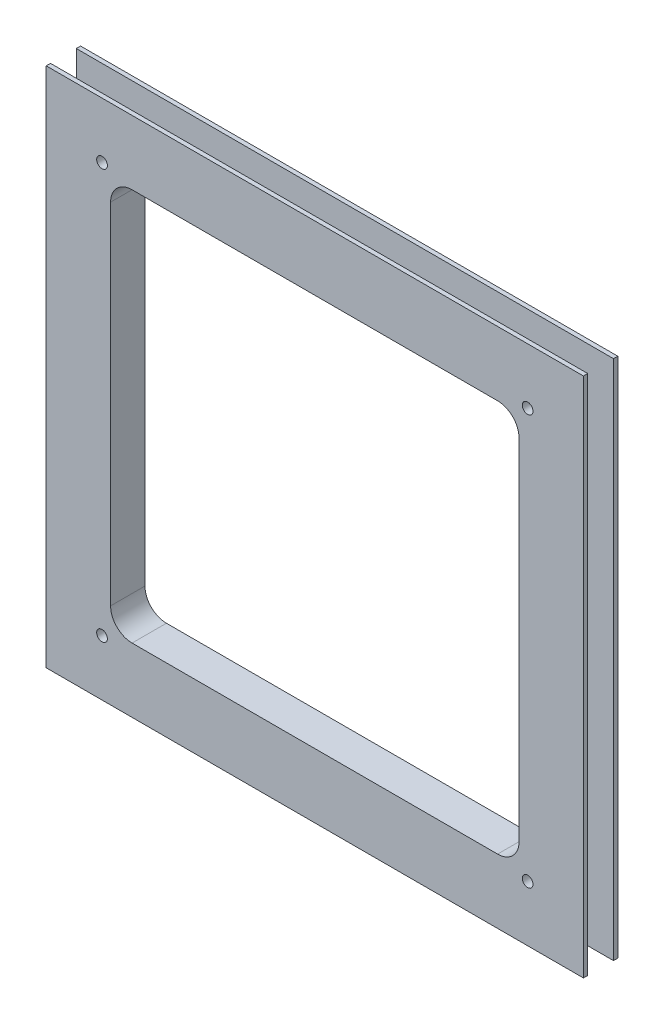
ISO-10303-21;
HEADER;
FILE_DESCRIPTION(('STEP AP214'),'2;1');
FILE_NAME('part.step','',(''),(''),'','','');
FILE_SCHEMA(('AUTOMOTIVE_DESIGN { 1 0 10303 214 1 1 1 1 }'));
ENDSEC;
DATA;
#1=APPLICATION_CONTEXT('core data for automotive mechanical design processes');
#2=APPLICATION_PROTOCOL_DEFINITION('international standard','automotive_design',2000,#1);
#3=PRODUCT_CONTEXT('',#1,'mechanical');
#4=PRODUCT('Part','Part','',(#3));
#5=PRODUCT_RELATED_PRODUCT_CATEGORY('part','',(#4));
#6=PRODUCT_DEFINITION_FORMATION('','',#4);
#7=PRODUCT_DEFINITION_CONTEXT('part definition',#1,'design');
#8=PRODUCT_DEFINITION('design','',#6,#7);
#9=PRODUCT_DEFINITION_SHAPE('','',#8);
#10=(LENGTH_UNIT() NAMED_UNIT(*) SI_UNIT(.MILLI.,.METRE.));
#11=(NAMED_UNIT(*) PLANE_ANGLE_UNIT() SI_UNIT($,.RADIAN.));
#12=(NAMED_UNIT(*) SI_UNIT($,.STERADIAN.) SOLID_ANGLE_UNIT());
#13=UNCERTAINTY_MEASURE_WITH_UNIT(LENGTH_MEASURE(1.E-05),#10,'distance_accuracy_value','');
#14=(GEOMETRIC_REPRESENTATION_CONTEXT(3) GLOBAL_UNCERTAINTY_ASSIGNED_CONTEXT((#13)) GLOBAL_UNIT_ASSIGNED_CONTEXT((#10,
#11,#12)) REPRESENTATION_CONTEXT('',''));
#15=CARTESIAN_POINT('',(0.,0.,0.));
#16=DIRECTION('',(0.,0.,1.));
#17=DIRECTION('',(1.,0.,0.));
#18=AXIS2_PLACEMENT_3D('',#15,#16,#17);
#19=CARTESIAN_POINT('',(0.,0.,6.));
#20=DIRECTION('',(0.,0.,1.));
#21=DIRECTION('',(1.,0.,0.));
#22=AXIS2_PLACEMENT_3D('',#19,#20,#21);
#23=PLANE('',#22);
#24=DIRECTION('',(0.,1.,0.));
#25=VECTOR('',#24,1.);
#26=CARTESIAN_POINT('',(-125.15,-121.45,6.));
#27=LINE('',#26,#25);
#28=CARTESIAN_POINT('',(-125.15,-121.45,6.));
#29=VERTEX_POINT('',#28);
#30=CARTESIAN_POINT('',(-125.15,121.45,6.));
#31=VERTEX_POINT('',#30);
#32=EDGE_CURVE('E267',#29,#31,#27,.T.);
#33=ORIENTED_EDGE('',*,*,#32,.T.);
#34=DIRECTION('',(1.,0.,0.));
#35=VECTOR('',#34,1.);
#36=CARTESIAN_POINT('',(-125.15,121.45,6.));
#37=LINE('',#36,#35);
#38=CARTESIAN_POINT('',(125.15,121.45,6.));
#39=VERTEX_POINT('',#38);
#40=EDGE_CURVE('E273',#31,#39,#37,.T.);
#41=ORIENTED_EDGE('',*,*,#40,.T.);
#42=DIRECTION('',(0.,1.,0.));
#43=VECTOR('',#42,1.);
#44=CARTESIAN_POINT('',(125.15,-121.45,6.));
#45=LINE('',#44,#43);
#46=CARTESIAN_POINT('',(125.15,-121.45,6.));
#47=VERTEX_POINT('',#46);
#48=EDGE_CURVE('E279',#39,#47,#45,.F.);
#49=ORIENTED_EDGE('',*,*,#48,.T.);
#50=DIRECTION('',(1.,0.,0.));
#51=VECTOR('',#50,1.);
#52=CARTESIAN_POINT('',(-125.15,-121.45,6.));
#53=LINE('',#52,#51);
#54=EDGE_CURVE('E261',#47,#29,#53,.F.);
#55=ORIENTED_EDGE('',*,*,#54,.T.);
#56=EDGE_LOOP('',(#33,#41,#49,#55));
#57=FACE_BOUND('',#56,.T.);
#58=CARTESIAN_POINT('',(-102.15,98.45,6.));
#59=DIRECTION('',(0.,0.,1.));
#60=DIRECTION('',(1.,0.,0.));
#61=AXIS2_PLACEMENT_3D('',#58,#59,#60);
#62=CIRCLE('',#61,9.99999999999999);
#63=CARTESIAN_POINT('',(-112.15,98.45,6.));
#64=VERTEX_POINT('',#63);
#65=CARTESIAN_POINT('',(-102.15,108.45,6.));
#66=VERTEX_POINT('',#65);
#67=EDGE_CURVE('E243',#64,#66,#62,.F.);
#68=ORIENTED_EDGE('',*,*,#67,.F.);
#69=DIRECTION('',(0.,1.,0.));
#70=VECTOR('',#69,1.);
#71=CARTESIAN_POINT('',(-112.15,-108.45,6.));
#72=LINE('',#71,#70);
#73=CARTESIAN_POINT('',(-112.15,-98.45,6.));
#74=VERTEX_POINT('',#73);
#75=EDGE_CURVE('E166',#74,#64,#72,.T.);
#76=ORIENTED_EDGE('',*,*,#75,.F.);
#77=CARTESIAN_POINT('',(-102.15,-98.45,6.));
#78=DIRECTION('',(0.,0.,1.));
#79=DIRECTION('',(1.,0.,0.));
#80=AXIS2_PLACEMENT_3D('',#77,#78,#79);
#81=CIRCLE('',#80,9.99999999999999);
#82=CARTESIAN_POINT('',(-102.15,-108.45,6.));
#83=VERTEX_POINT('',#82);
#84=EDGE_CURVE('E247',#83,#74,#81,.F.);
#85=ORIENTED_EDGE('',*,*,#84,.F.);
#86=DIRECTION('',(1.,0.,0.));
#87=VECTOR('',#86,1.);
#88=CARTESIAN_POINT('',(112.15,-108.45,6.));
#89=LINE('',#88,#87);
#90=CARTESIAN_POINT('',(102.15,-108.45,6.));
#91=VERTEX_POINT('',#90);
#92=EDGE_CURVE('E170',#91,#83,#89,.F.);
#93=ORIENTED_EDGE('',*,*,#92,.F.);
#94=CARTESIAN_POINT('',(102.15,-98.45,6.));
#95=DIRECTION('',(0.,0.,1.));
#96=DIRECTION('',(1.,0.,0.));
#97=AXIS2_PLACEMENT_3D('',#94,#95,#96);
#98=CIRCLE('',#97,9.99999999999999);
#99=CARTESIAN_POINT('',(112.15,-98.45,6.));
#100=VERTEX_POINT('',#99);
#101=EDGE_CURVE('E144',#100,#91,#98,.F.);
#102=ORIENTED_EDGE('',*,*,#101,.F.);
#103=DIRECTION('',(0.,1.,0.));
#104=VECTOR('',#103,1.);
#105=CARTESIAN_POINT('',(112.15,-108.45,6.));
#106=LINE('',#105,#104);
#107=CARTESIAN_POINT('',(112.15,98.45,6.));
#108=VERTEX_POINT('',#107);
#109=EDGE_CURVE('E139',#108,#100,#106,.F.);
#110=ORIENTED_EDGE('',*,*,#109,.F.);
#111=CARTESIAN_POINT('',(102.15,98.45,6.));
#112=DIRECTION('',(0.,0.,1.));
#113=DIRECTION('',(1.,0.,0.));
#114=AXIS2_PLACEMENT_3D('',#111,#112,#113);
#115=CIRCLE('',#114,9.99999999999999);
#116=CARTESIAN_POINT('',(102.15,108.45,6.));
#117=VERTEX_POINT('',#116);
#118=EDGE_CURVE('E19',#117,#108,#115,.F.);
#119=ORIENTED_EDGE('',*,*,#118,.F.);
#120=DIRECTION('',(1.,0.,0.));
#121=VECTOR('',#120,1.);
#122=CARTESIAN_POINT('',(112.15,108.45,6.));
#123=LINE('',#122,#121);
#124=EDGE_CURVE('E134',#66,#117,#123,.T.);
#125=ORIENTED_EDGE('',*,*,#124,.F.);
#126=EDGE_LOOP('',(#68,#76,#85,#93,#102,#110,#119,#125));
#127=FACE_BOUND('',#126,.T.);
#128=ADVANCED_FACE('F16',(#57,#127),#23,.F.);
#129=CARTESIAN_POINT('',(112.15,108.45,-6.));
#130=DIRECTION('',(0.,1.,0.));
#131=DIRECTION('',(0.,0.,1.));
#132=AXIS2_PLACEMENT_3D('',#129,#130,#131);
#133=PLANE('',#132);
#134=DIRECTION('',(1.,0.,0.));
#135=VECTOR('',#134,1.);
#136=CARTESIAN_POINT('',(0.,108.45,-6.));
#137=LINE('',#136,#135);
#138=CARTESIAN_POINT('',(-102.15,108.45,-6.));
#139=VERTEX_POINT('',#138);
#140=CARTESIAN_POINT('',(102.15,108.45,-6.));
#141=VERTEX_POINT('',#140);
#142=EDGE_CURVE('E242',#139,#141,#137,.T.);
#143=ORIENTED_EDGE('',*,*,#142,.F.);
#144=DIRECTION('',(0.,0.,1.));
#145=VECTOR('',#144,1.);
#146=CARTESIAN_POINT('',(-102.15,108.45,-6.));
#147=LINE('',#146,#145);
#148=EDGE_CURVE('E246',#66,#139,#147,.F.);
#149=ORIENTED_EDGE('',*,*,#148,.F.);
#150=ORIENTED_EDGE('',*,*,#124,.T.);
#151=DIRECTION('',(0.,0.,1.));
#152=VECTOR('',#151,1.);
#153=CARTESIAN_POINT('',(102.15,108.45,-6.));
#154=LINE('',#153,#152);
#155=EDGE_CURVE('E154',#141,#117,#154,.T.);
#156=ORIENTED_EDGE('',*,*,#155,.F.);
#157=EDGE_LOOP('',(#143,#149,#150,#156));
#158=FACE_BOUND('',#157,.T.);
#159=ADVANCED_FACE('F497',(#158),#133,.T.);
#160=CARTESIAN_POINT('',(102.15,98.45,-6.));
#161=DIRECTION('',(0.,0.,1.));
#162=DIRECTION('',(1.,0.,0.));
#163=AXIS2_PLACEMENT_3D('',#160,#161,#162);
#164=CYLINDRICAL_SURFACE('',#163,9.99999999999999);
#165=ORIENTED_EDGE('',*,*,#118,.T.);
#166=DIRECTION('',(0.,0.,-1.));
#167=VECTOR('',#166,1.);
#168=CARTESIAN_POINT('',(112.15,98.45,-6.));
#169=LINE('',#168,#167);
#170=CARTESIAN_POINT('',(112.15,98.45,-6.));
#171=VERTEX_POINT('',#170);
#172=EDGE_CURVE('E148',#171,#108,#169,.F.);
#173=ORIENTED_EDGE('',*,*,#172,.F.);
#174=CARTESIAN_POINT('',(102.15,98.45,-6.));
#175=DIRECTION('',(0.,0.,1.));
#176=DIRECTION('',(1.,0.,0.));
#177=AXIS2_PLACEMENT_3D('',#174,#175,#176);
#178=CIRCLE('',#177,9.99999999999999);
#179=EDGE_CURVE('E240',#141,#171,#178,.F.);
#180=ORIENTED_EDGE('',*,*,#179,.F.);
#181=ORIENTED_EDGE('',*,*,#155,.T.);
#182=EDGE_LOOP('',(#165,#173,#180,#181));
#183=FACE_BOUND('',#182,.T.);
#184=ADVANCED_FACE('F151',(#183),#164,.T.);
#185=CARTESIAN_POINT('',(112.15,-108.45,-6.));
#186=DIRECTION('',(1.,0.,0.));
#187=DIRECTION('',(0.,0.,-1.));
#188=AXIS2_PLACEMENT_3D('',#185,#186,#187);
#189=PLANE('',#188);
#190=DIRECTION('',(0.,1.,0.));
#191=VECTOR('',#190,1.);
#192=CARTESIAN_POINT('',(112.15,0.,-6.));
#193=LINE('',#192,#191);
#194=CARTESIAN_POINT('',(112.15,-98.45,-6.));
#195=VERTEX_POINT('',#194);
#196=EDGE_CURVE('E157',#171,#195,#193,.F.);
#197=ORIENTED_EDGE('',*,*,#196,.F.);
#198=ORIENTED_EDGE('',*,*,#172,.T.);
#199=ORIENTED_EDGE('',*,*,#109,.T.);
#200=DIRECTION('',(0.,0.,1.));
#201=VECTOR('',#200,1.);
#202=CARTESIAN_POINT('',(112.15,-98.45,-6.));
#203=LINE('',#202,#201);
#204=EDGE_CURVE('E159',#195,#100,#203,.T.);
#205=ORIENTED_EDGE('',*,*,#204,.F.);
#206=EDGE_LOOP('',(#197,#198,#199,#205));
#207=FACE_BOUND('',#206,.T.);
#208=ADVANCED_FACE('F155',(#207),#189,.T.);
#209=CARTESIAN_POINT('',(102.15,-98.45,-6.));
#210=DIRECTION('',(0.,0.,1.));
#211=DIRECTION('',(1.,0.,0.));
#212=AXIS2_PLACEMENT_3D('',#209,#210,#211);
#213=CYLINDRICAL_SURFACE('',#212,9.99999999999999);
#214=ORIENTED_EDGE('',*,*,#101,.T.);
#215=DIRECTION('',(0.,0.,-1.));
#216=VECTOR('',#215,1.);
#217=CARTESIAN_POINT('',(102.15,-108.45,-6.));
#218=LINE('',#217,#216);
#219=CARTESIAN_POINT('',(102.15,-108.45,-6.));
#220=VERTEX_POINT('',#219);
#221=EDGE_CURVE('E172',#220,#91,#218,.F.);
#222=ORIENTED_EDGE('',*,*,#221,.F.);
#223=CARTESIAN_POINT('',(102.15,-98.45,-6.));
#224=DIRECTION('',(0.,0.,1.));
#225=DIRECTION('',(1.,0.,0.));
#226=AXIS2_PLACEMENT_3D('',#223,#224,#225);
#227=CIRCLE('',#226,9.99999999999999);
#228=EDGE_CURVE('E237',#195,#220,#227,.F.);
#229=ORIENTED_EDGE('',*,*,#228,.F.);
#230=ORIENTED_EDGE('',*,*,#204,.T.);
#231=EDGE_LOOP('',(#214,#222,#229,#230));
#232=FACE_BOUND('',#231,.T.);
#233=ADVANCED_FACE('F491',(#232),#213,.T.);
#234=CARTESIAN_POINT('',(112.15,-108.45,-6.));
#235=DIRECTION('',(0.,-1.,0.));
#236=DIRECTION('',(0.,0.,-1.));
#237=AXIS2_PLACEMENT_3D('',#234,#235,#236);
#238=PLANE('',#237);
#239=ORIENTED_EDGE('',*,*,#92,.T.);
#240=DIRECTION('',(0.,0.,1.));
#241=VECTOR('',#240,1.);
#242=CARTESIAN_POINT('',(-102.15,-108.45,-6.));
#243=LINE('',#242,#241);
#244=CARTESIAN_POINT('',(-102.15,-108.45,-6.));
#245=VERTEX_POINT('',#244);
#246=EDGE_CURVE('E171',#245,#83,#243,.T.);
#247=ORIENTED_EDGE('',*,*,#246,.F.);
#248=DIRECTION('',(1.,0.,0.));
#249=VECTOR('',#248,1.);
#250=CARTESIAN_POINT('',(0.,-108.45,-6.));
#251=LINE('',#250,#249);
#252=EDGE_CURVE('E236',#220,#245,#251,.F.);
#253=ORIENTED_EDGE('',*,*,#252,.F.);
#254=ORIENTED_EDGE('',*,*,#221,.T.);
#255=EDGE_LOOP('',(#239,#247,#253,#254));
#256=FACE_BOUND('',#255,.T.);
#257=ADVANCED_FACE('F487',(#256),#238,.T.);
#258=CARTESIAN_POINT('',(-102.15,-98.45,-6.));
#259=DIRECTION('',(0.,0.,1.));
#260=DIRECTION('',(1.,0.,0.));
#261=AXIS2_PLACEMENT_3D('',#258,#259,#260);
#262=CYLINDRICAL_SURFACE('',#261,9.99999999999999);
#263=ORIENTED_EDGE('',*,*,#84,.T.);
#264=DIRECTION('',(0.,0.,1.));
#265=VECTOR('',#264,1.);
#266=CARTESIAN_POINT('',(-112.15,-98.45,-6.));
#267=LINE('',#266,#265);
#268=CARTESIAN_POINT('',(-112.15,-98.45,-6.));
#269=VERTEX_POINT('',#268);
#270=EDGE_CURVE('E169',#269,#74,#267,.T.);
#271=ORIENTED_EDGE('',*,*,#270,.F.);
#272=CARTESIAN_POINT('',(-102.15,-98.45,-6.));
#273=DIRECTION('',(0.,0.,1.));
#274=DIRECTION('',(1.,0.,0.));
#275=AXIS2_PLACEMENT_3D('',#272,#273,#274);
#276=CIRCLE('',#275,9.99999999999999);
#277=EDGE_CURVE('E233',#245,#269,#276,.F.);
#278=ORIENTED_EDGE('',*,*,#277,.F.);
#279=ORIENTED_EDGE('',*,*,#246,.T.);
#280=EDGE_LOOP('',(#263,#271,#278,#279));
#281=FACE_BOUND('',#280,.T.);
#282=ADVANCED_FACE('F483',(#281),#262,.T.);
#283=CARTESIAN_POINT('',(-112.15,-108.45,-6.));
#284=DIRECTION('',(-1.,0.,0.));
#285=DIRECTION('',(0.,0.,1.));
#286=AXIS2_PLACEMENT_3D('',#283,#284,#285);
#287=PLANE('',#286);
#288=ORIENTED_EDGE('',*,*,#75,.T.);
#289=DIRECTION('',(0.,0.,1.));
#290=VECTOR('',#289,1.);
#291=CARTESIAN_POINT('',(-112.15,98.45,-6.));
#292=LINE('',#291,#290);
#293=CARTESIAN_POINT('',(-112.15,98.45,-6.));
#294=VERTEX_POINT('',#293);
#295=EDGE_CURVE('E168',#294,#64,#292,.T.);
#296=ORIENTED_EDGE('',*,*,#295,.F.);
#297=DIRECTION('',(0.,1.,0.));
#298=VECTOR('',#297,1.);
#299=CARTESIAN_POINT('',(-112.15,0.,-6.));
#300=LINE('',#299,#298);
#301=EDGE_CURVE('E232',#269,#294,#300,.T.);
#302=ORIENTED_EDGE('',*,*,#301,.F.);
#303=ORIENTED_EDGE('',*,*,#270,.T.);
#304=EDGE_LOOP('',(#288,#296,#302,#303));
#305=FACE_BOUND('',#304,.T.);
#306=ADVANCED_FACE('F479',(#305),#287,.T.);
#307=CARTESIAN_POINT('',(-102.15,98.45,-6.));
#308=DIRECTION('',(0.,0.,1.));
#309=DIRECTION('',(1.,0.,0.));
#310=AXIS2_PLACEMENT_3D('',#307,#308,#309);
#311=CYLINDRICAL_SURFACE('',#310,9.99999999999999);
#312=ORIENTED_EDGE('',*,*,#67,.T.);
#313=ORIENTED_EDGE('',*,*,#148,.T.);
#314=CARTESIAN_POINT('',(-102.15,98.45,-6.));
#315=DIRECTION('',(0.,0.,1.));
#316=DIRECTION('',(1.,0.,0.));
#317=AXIS2_PLACEMENT_3D('',#314,#315,#316);
#318=CIRCLE('',#317,9.99999999999999);
#319=EDGE_CURVE('E228',#294,#139,#318,.F.);
#320=ORIENTED_EDGE('',*,*,#319,.F.);
#321=ORIENTED_EDGE('',*,*,#295,.T.);
#322=EDGE_LOOP('',(#312,#313,#320,#321));
#323=FACE_BOUND('',#322,.T.);
#324=ADVANCED_FACE('F475',(#323),#311,.T.);
#325=CARTESIAN_POINT('',(-125.15,-121.45,8.));
#326=DIRECTION('',(0.,1.,0.));
#327=DIRECTION('',(0.,0.,1.));
#328=AXIS2_PLACEMENT_3D('',#325,#326,#327);
#329=PLANE('',#328);
#330=ORIENTED_EDGE('',*,*,#54,.F.);
#331=DIRECTION('',(0.,0.,1.));
#332=VECTOR('',#331,1.);
#333=CARTESIAN_POINT('',(125.15,-121.45,8.));
#334=LINE('',#333,#332);
#335=CARTESIAN_POINT('',(125.15,-121.45,8.));
#336=VERTEX_POINT('',#335);
#337=EDGE_CURVE('E282',#47,#336,#334,.T.);
#338=ORIENTED_EDGE('',*,*,#337,.T.);
#339=DIRECTION('',(-1.,0.,0.));
#340=VECTOR('',#339,1.);
#341=CARTESIAN_POINT('',(0.,-121.45,8.));
#342=LINE('',#341,#340);
#343=CARTESIAN_POINT('',(-125.15,-121.45,8.));
#344=VERTEX_POINT('',#343);
#345=EDGE_CURVE('E231',#336,#344,#342,.T.);
#346=ORIENTED_EDGE('',*,*,#345,.T.);
#347=DIRECTION('',(0.,0.,-1.));
#348=VECTOR('',#347,1.);
#349=CARTESIAN_POINT('',(-125.15,-121.45,8.));
#350=LINE('',#349,#348);
#351=EDGE_CURVE('E264',#344,#29,#350,.T.);
#352=ORIENTED_EDGE('',*,*,#351,.T.);
#353=EDGE_LOOP('',(#330,#338,#346,#352));
#354=FACE_BOUND('',#353,.T.);
#355=ADVANCED_FACE('F471',(#354),#329,.F.);
#356=CARTESIAN_POINT('',(-125.15,-121.45,8.));
#357=DIRECTION('',(1.,0.,0.));
#358=DIRECTION('',(0.,0.,-1.));
#359=AXIS2_PLACEMENT_3D('',#356,#357,#358);
#360=PLANE('',#359);
#361=ORIENTED_EDGE('',*,*,#32,.F.);
#362=ORIENTED_EDGE('',*,*,#351,.F.);
#363=DIRECTION('',(0.,1.,0.));
#364=VECTOR('',#363,1.);
#365=CARTESIAN_POINT('',(-125.15,0.,8.));
#366=LINE('',#365,#364);
#367=CARTESIAN_POINT('',(-125.15,121.45,8.));
#368=VERTEX_POINT('',#367);
#369=EDGE_CURVE('E302',#344,#368,#366,.T.);
#370=ORIENTED_EDGE('',*,*,#369,.T.);
#371=DIRECTION('',(0.,0.,-1.));
#372=VECTOR('',#371,1.);
#373=CARTESIAN_POINT('',(-125.15,121.45,8.));
#374=LINE('',#373,#372);
#375=EDGE_CURVE('E270',#368,#31,#374,.T.);
#376=ORIENTED_EDGE('',*,*,#375,.T.);
#377=EDGE_LOOP('',(#361,#362,#370,#376));
#378=FACE_BOUND('',#377,.T.);
#379=ADVANCED_FACE('F467',(#378),#360,.F.);
#380=CARTESIAN_POINT('',(-125.15,121.45,8.));
#381=DIRECTION('',(0.,-1.,0.));
#382=DIRECTION('',(0.,0.,-1.));
#383=AXIS2_PLACEMENT_3D('',#380,#381,#382);
#384=PLANE('',#383);
#385=ORIENTED_EDGE('',*,*,#40,.F.);
#386=ORIENTED_EDGE('',*,*,#375,.F.);
#387=DIRECTION('',(-1.,0.,0.));
#388=VECTOR('',#387,1.);
#389=CARTESIAN_POINT('',(0.,121.45,8.));
#390=LINE('',#389,#388);
#391=CARTESIAN_POINT('',(125.15,121.45,8.));
#392=VERTEX_POINT('',#391);
#393=EDGE_CURVE('E305',#368,#392,#390,.F.);
#394=ORIENTED_EDGE('',*,*,#393,.T.);
#395=DIRECTION('',(0.,0.,1.));
#396=VECTOR('',#395,1.);
#397=CARTESIAN_POINT('',(125.15,121.45,8.));
#398=LINE('',#397,#396);
#399=EDGE_CURVE('E276',#392,#39,#398,.F.);
#400=ORIENTED_EDGE('',*,*,#399,.T.);
#401=EDGE_LOOP('',(#385,#386,#394,#400));
#402=FACE_BOUND('',#401,.T.);
#403=ADVANCED_FACE('F463',(#402),#384,.F.);
#404=CARTESIAN_POINT('',(125.15,-121.45,8.));
#405=DIRECTION('',(-1.,0.,0.));
#406=DIRECTION('',(0.,0.,1.));
#407=AXIS2_PLACEMENT_3D('',#404,#405,#406);
#408=PLANE('',#407);
#409=ORIENTED_EDGE('',*,*,#48,.F.);
#410=ORIENTED_EDGE('',*,*,#399,.F.);
#411=DIRECTION('',(0.,1.,0.));
#412=VECTOR('',#411,1.);
#413=CARTESIAN_POINT('',(125.15,0.,8.));
#414=LINE('',#413,#412);
#415=EDGE_CURVE('E227',#392,#336,#414,.F.);
#416=ORIENTED_EDGE('',*,*,#415,.T.);
#417=ORIENTED_EDGE('',*,*,#337,.F.);
#418=EDGE_LOOP('',(#409,#410,#416,#417));
#419=FACE_BOUND('',#418,.T.);
#420=ADVANCED_FACE('F459',(#419),#408,.F.);
#421=CARTESIAN_POINT('',(0.,0.,-6.));
#422=DIRECTION('',(0.,0.,1.));
#423=DIRECTION('',(1.,0.,0.));
#424=AXIS2_PLACEMENT_3D('',#421,#422,#423);
#425=PLANE('',#424);
#426=DIRECTION('',(0.,1.,0.));
#427=VECTOR('',#426,1.);
#428=CARTESIAN_POINT('',(-125.15,-121.45,-6.));
#429=LINE('',#428,#427);
#430=CARTESIAN_POINT('',(-125.15,121.45,-6.));
#431=VERTEX_POINT('',#430);
#432=CARTESIAN_POINT('',(-125.15,-121.45,-6.));
#433=VERTEX_POINT('',#432);
#434=EDGE_CURVE('E324',#431,#433,#429,.F.);
#435=ORIENTED_EDGE('',*,*,#434,.T.);
#436=DIRECTION('',(1.,0.,0.));
#437=VECTOR('',#436,1.);
#438=CARTESIAN_POINT('',(-125.15,-121.45,-6.));
#439=LINE('',#438,#437);
#440=CARTESIAN_POINT('',(125.15,-121.45,-6.));
#441=VERTEX_POINT('',#440);
#442=EDGE_CURVE('E318',#433,#441,#439,.T.);
#443=ORIENTED_EDGE('',*,*,#442,.T.);
#444=DIRECTION('',(0.,1.,0.));
#445=VECTOR('',#444,1.);
#446=CARTESIAN_POINT('',(125.15,-121.45,-6.));
#447=LINE('',#446,#445);
#448=CARTESIAN_POINT('',(125.15,121.45,-6.));
#449=VERTEX_POINT('',#448);
#450=EDGE_CURVE('E217',#441,#449,#447,.T.);
#451=ORIENTED_EDGE('',*,*,#450,.T.);
#452=DIRECTION('',(1.,0.,0.));
#453=VECTOR('',#452,1.);
#454=CARTESIAN_POINT('',(-125.15,121.45,-6.));
#455=LINE('',#454,#453);
#456=EDGE_CURVE('E299',#449,#431,#455,.F.);
#457=ORIENTED_EDGE('',*,*,#456,.T.);
#458=EDGE_LOOP('',(#435,#443,#451,#457));
#459=FACE_BOUND('',#458,.T.);
#460=ORIENTED_EDGE('',*,*,#301,.T.);
#461=ORIENTED_EDGE('',*,*,#319,.T.);
#462=ORIENTED_EDGE('',*,*,#142,.T.);
#463=ORIENTED_EDGE('',*,*,#179,.T.);
#464=ORIENTED_EDGE('',*,*,#196,.T.);
#465=ORIENTED_EDGE('',*,*,#228,.T.);
#466=ORIENTED_EDGE('',*,*,#252,.T.);
#467=ORIENTED_EDGE('',*,*,#277,.T.);
#468=EDGE_LOOP('',(#460,#461,#462,#463,#464,#465,#466,#467));
#469=FACE_BOUND('',#468,.T.);
#470=ADVANCED_FACE('F456',(#459,#469),#425,.T.);
#471=CARTESIAN_POINT('',(0.,0.,8.));
#472=DIRECTION('',(0.,0.,-1.));
#473=DIRECTION('',(-1.,0.,0.));
#474=AXIS2_PLACEMENT_3D('',#471,#472,#473);
#475=PLANE('',#474);
#476=CARTESIAN_POINT('',(85.15,-81.45,8.00000000000001));
#477=DIRECTION('',(0.,0.,-1.));
#478=DIRECTION('',(-1.,0.,0.));
#479=AXIS2_PLACEMENT_3D('',#476,#477,#478);
#480=CIRCLE('',#479,9.99999999999999);
#481=CARTESIAN_POINT('',(95.15,-81.45,8.00000000000001));
#482=VERTEX_POINT('',#481);
#483=CARTESIAN_POINT('',(85.15,-91.45,8.00000000000001));
#484=VERTEX_POINT('',#483);
#485=EDGE_CURVE('E206',#482,#484,#480,.T.);
#486=ORIENTED_EDGE('',*,*,#485,.T.);
#487=DIRECTION('',(1.,0.,0.));
#488=VECTOR('',#487,1.);
#489=CARTESIAN_POINT('',(-95.15,-91.45,8.00000000000001));
#490=LINE('',#489,#488);
#491=CARTESIAN_POINT('',(-85.15,-91.45,8.00000000000001));
#492=VERTEX_POINT('',#491);
#493=EDGE_CURVE('E209',#484,#492,#490,.F.);
#494=ORIENTED_EDGE('',*,*,#493,.T.);
#495=CARTESIAN_POINT('',(-85.15,-81.45,8.00000000000001));
#496=DIRECTION('',(0.,0.,-1.));
#497=DIRECTION('',(-1.,0.,0.));
#498=AXIS2_PLACEMENT_3D('',#495,#496,#497);
#499=CIRCLE('',#498,9.99999999999999);
#500=CARTESIAN_POINT('',(-95.15,-81.45,8.00000000000001));
#501=VERTEX_POINT('',#500);
#502=EDGE_CURVE('E210',#492,#501,#499,.T.);
#503=ORIENTED_EDGE('',*,*,#502,.T.);
#504=DIRECTION('',(0.,1.,0.));
#505=VECTOR('',#504,1.);
#506=CARTESIAN_POINT('',(-95.15,91.45,8.00000000000001));
#507=LINE('',#506,#505);
#508=CARTESIAN_POINT('',(-95.15,81.45,8.00000000000001));
#509=VERTEX_POINT('',#508);
#510=EDGE_CURVE('E213',#501,#509,#507,.T.);
#511=ORIENTED_EDGE('',*,*,#510,.T.);
#512=CARTESIAN_POINT('',(-85.15,81.45,8.00000000000001));
#513=DIRECTION('',(0.,0.,-1.));
#514=DIRECTION('',(-1.,0.,0.));
#515=AXIS2_PLACEMENT_3D('',#512,#513,#514);
#516=CIRCLE('',#515,9.99999999999999);
#517=CARTESIAN_POINT('',(-85.15,91.45,8.00000000000001));
#518=VERTEX_POINT('',#517);
#519=EDGE_CURVE('E199',#509,#518,#516,.T.);
#520=ORIENTED_EDGE('',*,*,#519,.T.);
#521=DIRECTION('',(1.,0.,0.));
#522=VECTOR('',#521,1.);
#523=CARTESIAN_POINT('',(95.15,91.45,8.00000000000001));
#524=LINE('',#523,#522);
#525=CARTESIAN_POINT('',(85.15,91.45,8.00000000000001));
#526=VERTEX_POINT('',#525);
#527=EDGE_CURVE('E310',#518,#526,#524,.T.);
#528=ORIENTED_EDGE('',*,*,#527,.T.);
#529=CARTESIAN_POINT('',(85.15,81.45,8.00000000000001));
#530=DIRECTION('',(0.,0.,-1.));
#531=DIRECTION('',(-1.,0.,0.));
#532=AXIS2_PLACEMENT_3D('',#529,#530,#531);
#533=CIRCLE('',#532,9.99999999999999);
#534=CARTESIAN_POINT('',(95.15,81.45,8.00000000000001));
#535=VERTEX_POINT('',#534);
#536=EDGE_CURVE('E202',#526,#535,#533,.T.);
#537=ORIENTED_EDGE('',*,*,#536,.T.);
#538=DIRECTION('',(0.,1.,0.));
#539=VECTOR('',#538,1.);
#540=CARTESIAN_POINT('',(95.15,-91.45,8.00000000000001));
#541=LINE('',#540,#539);
#542=EDGE_CURVE('E205',#535,#482,#541,.F.);
#543=ORIENTED_EDGE('',*,*,#542,.T.);
#544=EDGE_LOOP('',(#486,#494,#503,#511,#520,#528,#537,#543));
#545=FACE_BOUND('',#544,.T.);
#546=ORIENTED_EDGE('',*,*,#393,.F.);
#547=ORIENTED_EDGE('',*,*,#369,.F.);
#548=ORIENTED_EDGE('',*,*,#345,.F.);
#549=ORIENTED_EDGE('',*,*,#415,.F.);
#550=EDGE_LOOP('',(#546,#547,#548,#549));
#551=FACE_BOUND('',#550,.T.);
#552=CARTESIAN_POINT('',(-99.15,-95.45,8.));
#553=DIRECTION('',(0.,0.,1.));
#554=DIRECTION('',(1.,0.,0.));
#555=AXIS2_PLACEMENT_3D('',#552,#553,#554);
#556=CIRCLE('',#555,2.5);
#557=CARTESIAN_POINT('',(-96.65,-95.45,8.));
#558=VERTEX_POINT('',#557);
#559=EDGE_CURVE('E214',#558,#558,#556,.F.);
#560=ORIENTED_EDGE('',*,*,#559,.T.);
#561=EDGE_LOOP('',(#560));
#562=FACE_BOUND('',#561,.T.);
#563=CARTESIAN_POINT('',(99.15,-95.45,8.));
#564=DIRECTION('',(0.,0.,1.));
#565=DIRECTION('',(1.,0.,0.));
#566=AXIS2_PLACEMENT_3D('',#563,#564,#565);
#567=CIRCLE('',#566,2.5);
#568=CARTESIAN_POINT('',(101.65,-95.45,8.));
#569=VERTEX_POINT('',#568);
#570=EDGE_CURVE('E218',#569,#569,#567,.F.);
#571=ORIENTED_EDGE('',*,*,#570,.T.);
#572=EDGE_LOOP('',(#571));
#573=FACE_BOUND('',#572,.T.);
#574=CARTESIAN_POINT('',(99.15,95.45,8.));
#575=DIRECTION('',(0.,0.,1.));
#576=DIRECTION('',(1.,0.,0.));
#577=AXIS2_PLACEMENT_3D('',#574,#575,#576);
#578=CIRCLE('',#577,2.5);
#579=CARTESIAN_POINT('',(101.65,95.45,8.));
#580=VERTEX_POINT('',#579);
#581=EDGE_CURVE('E221',#580,#580,#578,.F.);
#582=ORIENTED_EDGE('',*,*,#581,.T.);
#583=EDGE_LOOP('',(#582));
#584=FACE_BOUND('',#583,.T.);
#585=CARTESIAN_POINT('',(-99.15,95.45,8.));
#586=DIRECTION('',(0.,0.,1.));
#587=DIRECTION('',(1.,0.,0.));
#588=AXIS2_PLACEMENT_3D('',#585,#586,#587);
#589=CIRCLE('',#588,2.5);
#590=CARTESIAN_POINT('',(-96.65,95.45,8.));
#591=VERTEX_POINT('',#590);
#592=EDGE_CURVE('E224',#591,#591,#589,.F.);
#593=ORIENTED_EDGE('',*,*,#592,.T.);
#594=EDGE_LOOP('',(#593));
#595=FACE_BOUND('',#594,.T.);
#596=ADVANCED_FACE('F374',(#545,#551,#562,#573,#584,#595),#475,.F.);
#597=CARTESIAN_POINT('',(-99.15,95.45,8.));
#598=DIRECTION('',(0.,0.,1.));
#599=DIRECTION('',(1.,0.,0.));
#600=AXIS2_PLACEMENT_3D('',#597,#598,#599);
#601=CYLINDRICAL_SURFACE('',#600,2.5);
#602=ORIENTED_EDGE('',*,*,#592,.F.);
#603=EDGE_LOOP('',(#602));
#604=FACE_BOUND('',#603,.T.);
#605=CARTESIAN_POINT('',(-99.15,95.45,-8.00000000000001));
#606=DIRECTION('',(0.,0.,1.));
#607=DIRECTION('',(1.,0.,0.));
#608=AXIS2_PLACEMENT_3D('',#605,#606,#607);
#609=CIRCLE('',#608,2.5);
#610=CARTESIAN_POINT('',(-96.65,95.45,-8.00000000000001));
#611=VERTEX_POINT('',#610);
#612=EDGE_CURVE('E196',#611,#611,#609,.T.);
#613=ORIENTED_EDGE('',*,*,#612,.F.);
#614=EDGE_LOOP('',(#613));
#615=FACE_BOUND('',#614,.T.);
#616=ADVANCED_FACE('F449',(#604,#615),#601,.F.);
#617=CARTESIAN_POINT('',(99.15,95.45,8.));
#618=DIRECTION('',(0.,0.,1.));
#619=DIRECTION('',(1.,0.,0.));
#620=AXIS2_PLACEMENT_3D('',#617,#618,#619);
#621=CYLINDRICAL_SURFACE('',#620,2.5);
#622=ORIENTED_EDGE('',*,*,#581,.F.);
#623=EDGE_LOOP('',(#622));
#624=FACE_BOUND('',#623,.T.);
#625=CARTESIAN_POINT('',(99.15,95.45,-8.00000000000001));
#626=DIRECTION('',(0.,0.,1.));
#627=DIRECTION('',(1.,0.,0.));
#628=AXIS2_PLACEMENT_3D('',#625,#626,#627);
#629=CIRCLE('',#628,2.5);
#630=CARTESIAN_POINT('',(101.65,95.45,-8.00000000000001));
#631=VERTEX_POINT('',#630);
#632=EDGE_CURVE('E193',#631,#631,#629,.T.);
#633=ORIENTED_EDGE('',*,*,#632,.F.);
#634=EDGE_LOOP('',(#633));
#635=FACE_BOUND('',#634,.T.);
#636=ADVANCED_FACE('F445',(#624,#635),#621,.F.);
#637=CARTESIAN_POINT('',(99.15,-95.45,8.));
#638=DIRECTION('',(0.,0.,1.));
#639=DIRECTION('',(1.,0.,0.));
#640=AXIS2_PLACEMENT_3D('',#637,#638,#639);
#641=CYLINDRICAL_SURFACE('',#640,2.5);
#642=ORIENTED_EDGE('',*,*,#570,.F.);
#643=EDGE_LOOP('',(#642));
#644=FACE_BOUND('',#643,.T.);
#645=CARTESIAN_POINT('',(99.15,-95.45,-8.00000000000001));
#646=DIRECTION('',(0.,0.,1.));
#647=DIRECTION('',(1.,0.,0.));
#648=AXIS2_PLACEMENT_3D('',#645,#646,#647);
#649=CIRCLE('',#648,2.5);
#650=CARTESIAN_POINT('',(101.65,-95.45,-8.00000000000001));
#651=VERTEX_POINT('',#650);
#652=EDGE_CURVE('E190',#651,#651,#649,.T.);
#653=ORIENTED_EDGE('',*,*,#652,.F.);
#654=EDGE_LOOP('',(#653));
#655=FACE_BOUND('',#654,.T.);
#656=ADVANCED_FACE('F441',(#644,#655),#641,.F.);
#657=CARTESIAN_POINT('',(-99.15,-95.45,8.));
#658=DIRECTION('',(0.,0.,1.));
#659=DIRECTION('',(1.,0.,0.));
#660=AXIS2_PLACEMENT_3D('',#657,#658,#659);
#661=CYLINDRICAL_SURFACE('',#660,2.5);
#662=ORIENTED_EDGE('',*,*,#559,.F.);
#663=EDGE_LOOP('',(#662));
#664=FACE_BOUND('',#663,.T.);
#665=CARTESIAN_POINT('',(-99.15,-95.45,-8.00000000000001));
#666=DIRECTION('',(0.,0.,1.));
#667=DIRECTION('',(1.,0.,0.));
#668=AXIS2_PLACEMENT_3D('',#665,#666,#667);
#669=CIRCLE('',#668,2.5);
#670=CARTESIAN_POINT('',(-96.65,-95.45,-8.00000000000001));
#671=VERTEX_POINT('',#670);
#672=EDGE_CURVE('E186',#671,#671,#669,.T.);
#673=ORIENTED_EDGE('',*,*,#672,.F.);
#674=EDGE_LOOP('',(#673));
#675=FACE_BOUND('',#674,.T.);
#676=ADVANCED_FACE('F437',(#664,#675),#661,.F.);
#677=CARTESIAN_POINT('',(125.15,-121.45,8.));
#678=DIRECTION('',(-1.,0.,0.));
#679=DIRECTION('',(0.,0.,1.));
#680=AXIS2_PLACEMENT_3D('',#677,#678,#679);
#681=PLANE('',#680);
#682=DIRECTION('',(0.,0.,1.));
#683=VECTOR('',#682,1.);
#684=CARTESIAN_POINT('',(125.15,-121.45,8.));
#685=LINE('',#684,#683);
#686=CARTESIAN_POINT('',(125.15,-121.45,-8.));
#687=VERTEX_POINT('',#686);
#688=EDGE_CURVE('E315',#441,#687,#685,.F.);
#689=ORIENTED_EDGE('',*,*,#688,.T.);
#690=DIRECTION('',(0.,1.,0.));
#691=VECTOR('',#690,1.);
#692=CARTESIAN_POINT('',(125.15,0.,-8.));
#693=LINE('',#692,#691);
#694=CARTESIAN_POINT('',(125.15,121.45,-8.));
#695=VERTEX_POINT('',#694);
#696=EDGE_CURVE('E189',#695,#687,#693,.F.);
#697=ORIENTED_EDGE('',*,*,#696,.F.);
#698=DIRECTION('',(0.,0.,-1.));
#699=VECTOR('',#698,1.);
#700=CARTESIAN_POINT('',(125.15,121.45,8.));
#701=LINE('',#700,#699);
#702=EDGE_CURVE('E330',#695,#449,#701,.F.);
#703=ORIENTED_EDGE('',*,*,#702,.T.);
#704=ORIENTED_EDGE('',*,*,#450,.F.);
#705=EDGE_LOOP('',(#689,#697,#703,#704));
#706=FACE_BOUND('',#705,.T.);
#707=ADVANCED_FACE('F433',(#706),#681,.F.);
#708=CARTESIAN_POINT('',(-125.15,-121.45,8.));
#709=DIRECTION('',(0.,1.,0.));
#710=DIRECTION('',(0.,0.,1.));
#711=AXIS2_PLACEMENT_3D('',#708,#709,#710);
#712=PLANE('',#711);
#713=DIRECTION('',(0.,0.,-1.));
#714=VECTOR('',#713,1.);
#715=CARTESIAN_POINT('',(-125.15,-121.45,8.));
#716=LINE('',#715,#714);
#717=CARTESIAN_POINT('',(-125.15,-121.45,-8.));
#718=VERTEX_POINT('',#717);
#719=EDGE_CURVE('E321',#433,#718,#716,.T.);
#720=ORIENTED_EDGE('',*,*,#719,.T.);
#721=DIRECTION('',(-1.,0.,0.));
#722=VECTOR('',#721,1.);
#723=CARTESIAN_POINT('',(0.,-121.45,-8.));
#724=LINE('',#723,#722);
#725=EDGE_CURVE('E346',#687,#718,#724,.T.);
#726=ORIENTED_EDGE('',*,*,#725,.F.);
#727=ORIENTED_EDGE('',*,*,#688,.F.);
#728=ORIENTED_EDGE('',*,*,#442,.F.);
#729=EDGE_LOOP('',(#720,#726,#727,#728));
#730=FACE_BOUND('',#729,.T.);
#731=ADVANCED_FACE('F429',(#730),#712,.F.);
#732=CARTESIAN_POINT('',(-125.15,-121.45,8.));
#733=DIRECTION('',(1.,0.,0.));
#734=DIRECTION('',(0.,0.,-1.));
#735=AXIS2_PLACEMENT_3D('',#732,#733,#734);
#736=PLANE('',#735);
#737=DIRECTION('',(0.,0.,-1.));
#738=VECTOR('',#737,1.);
#739=CARTESIAN_POINT('',(-125.15,121.45,8.));
#740=LINE('',#739,#738);
#741=CARTESIAN_POINT('',(-125.15,121.45,-8.));
#742=VERTEX_POINT('',#741);
#743=EDGE_CURVE('E327',#431,#742,#740,.T.);
#744=ORIENTED_EDGE('',*,*,#743,.T.);
#745=DIRECTION('',(0.,1.,0.));
#746=VECTOR('',#745,1.);
#747=CARTESIAN_POINT('',(-125.15,0.,-8.));
#748=LINE('',#747,#746);
#749=EDGE_CURVE('E349',#718,#742,#748,.T.);
#750=ORIENTED_EDGE('',*,*,#749,.F.);
#751=ORIENTED_EDGE('',*,*,#719,.F.);
#752=ORIENTED_EDGE('',*,*,#434,.F.);
#753=EDGE_LOOP('',(#744,#750,#751,#752));
#754=FACE_BOUND('',#753,.T.);
#755=ADVANCED_FACE('F425',(#754),#736,.F.);
#756=CARTESIAN_POINT('',(-125.15,121.45,8.));
#757=DIRECTION('',(0.,-1.,0.));
#758=DIRECTION('',(0.,0.,-1.));
#759=AXIS2_PLACEMENT_3D('',#756,#757,#758);
#760=PLANE('',#759);
#761=ORIENTED_EDGE('',*,*,#702,.F.);
#762=DIRECTION('',(-1.,0.,0.));
#763=VECTOR('',#762,1.);
#764=CARTESIAN_POINT('',(0.,121.45,-8.));
#765=LINE('',#764,#763);
#766=EDGE_CURVE('E352',#742,#695,#765,.F.);
#767=ORIENTED_EDGE('',*,*,#766,.F.);
#768=ORIENTED_EDGE('',*,*,#743,.F.);
#769=ORIENTED_EDGE('',*,*,#456,.F.);
#770=EDGE_LOOP('',(#761,#767,#768,#769));
#771=FACE_BOUND('',#770,.T.);
#772=ADVANCED_FACE('F422',(#771),#760,.F.);
#773=CARTESIAN_POINT('',(-95.15,91.45,-300.223373466258));
#774=DIRECTION('',(-1.,0.,0.));
#775=DIRECTION('',(0.,0.,1.));
#776=AXIS2_PLACEMENT_3D('',#773,#774,#775);
#777=PLANE('',#776);
#778=DIRECTION('',(0.,0.,-1.));
#779=VECTOR('',#778,1.);
#780=CARTESIAN_POINT('',(-95.15,-81.45,-300.223373466258));
#781=LINE('',#780,#779);
#782=CARTESIAN_POINT('',(-95.15,-81.45,-8.00000000000001));
#783=VERTEX_POINT('',#782);
#784=EDGE_CURVE('E212',#501,#783,#781,.T.);
#785=ORIENTED_EDGE('',*,*,#784,.T.);
#786=DIRECTION('',(0.,1.,0.));
#787=VECTOR('',#786,1.);
#788=CARTESIAN_POINT('',(-95.15,0.,-8.));
#789=LINE('',#788,#787);
#790=CARTESIAN_POINT('',(-95.15,81.45,-8.00000000000001));
#791=VERTEX_POINT('',#790);
#792=EDGE_CURVE('E185',#791,#783,#789,.F.);
#793=ORIENTED_EDGE('',*,*,#792,.F.);
#794=DIRECTION('',(0.,0.,-1.));
#795=VECTOR('',#794,1.);
#796=CARTESIAN_POINT('',(-95.15,81.45,-300.223373466258));
#797=LINE('',#796,#795);
#798=EDGE_CURVE('E201',#791,#509,#797,.F.);
#799=ORIENTED_EDGE('',*,*,#798,.T.);
#800=ORIENTED_EDGE('',*,*,#510,.F.);
#801=EDGE_LOOP('',(#785,#793,#799,#800));
#802=FACE_BOUND('',#801,.T.);
#803=ADVANCED_FACE('F395',(#802),#777,.F.);
#804=CARTESIAN_POINT('',(-85.15,-81.45,-300.223373466258));
#805=DIRECTION('',(0.,0.,-1.));
#806=DIRECTION('',(-1.,0.,0.));
#807=AXIS2_PLACEMENT_3D('',#804,#805,#806);
#808=CYLINDRICAL_SURFACE('',#807,9.99999999999999);
#809=ORIENTED_EDGE('',*,*,#784,.F.);
#810=ORIENTED_EDGE('',*,*,#502,.F.);
#811=DIRECTION('',(0.,0.,-1.));
#812=VECTOR('',#811,1.);
#813=CARTESIAN_POINT('',(-85.15,-91.45,-300.223373466258));
#814=LINE('',#813,#812);
#815=CARTESIAN_POINT('',(-85.15,-91.45,-8.00000000000001));
#816=VERTEX_POINT('',#815);
#817=EDGE_CURVE('E294',#492,#816,#814,.T.);
#818=ORIENTED_EDGE('',*,*,#817,.T.);
#819=CARTESIAN_POINT('',(-85.15,-81.45,-8.00000000000001));
#820=DIRECTION('',(0.,0.,-1.));
#821=DIRECTION('',(-1.,0.,0.));
#822=AXIS2_PLACEMENT_3D('',#819,#820,#821);
#823=CIRCLE('',#822,9.99999999999999);
#824=EDGE_CURVE('E182',#783,#816,#823,.F.);
#825=ORIENTED_EDGE('',*,*,#824,.F.);
#826=EDGE_LOOP('',(#809,#810,#818,#825));
#827=FACE_BOUND('',#826,.T.);
#828=ADVANCED_FACE('F392',(#827),#808,.F.);
#829=CARTESIAN_POINT('',(-95.15,-91.45,-300.223373466258));
#830=DIRECTION('',(0.,-1.,0.));
#831=DIRECTION('',(0.,0.,-1.));
#832=AXIS2_PLACEMENT_3D('',#829,#830,#831);
#833=PLANE('',#832);
#834=DIRECTION('',(0.,0.,-1.));
#835=VECTOR('',#834,1.);
#836=CARTESIAN_POINT('',(85.15,-91.45,-300.223373466258));
#837=LINE('',#836,#835);
#838=CARTESIAN_POINT('',(85.15,-91.45,-8.00000000000001));
#839=VERTEX_POINT('',#838);
#840=EDGE_CURVE('E208',#484,#839,#837,.T.);
#841=ORIENTED_EDGE('',*,*,#840,.T.);
#842=DIRECTION('',(-1.,0.,0.));
#843=VECTOR('',#842,1.);
#844=CARTESIAN_POINT('',(0.,-91.45,-8.));
#845=LINE('',#844,#843);
#846=EDGE_CURVE('E181',#816,#839,#845,.F.);
#847=ORIENTED_EDGE('',*,*,#846,.F.);
#848=ORIENTED_EDGE('',*,*,#817,.F.);
#849=ORIENTED_EDGE('',*,*,#493,.F.);
#850=EDGE_LOOP('',(#841,#847,#848,#849));
#851=FACE_BOUND('',#850,.T.);
#852=ADVANCED_FACE('F387',(#851),#833,.F.);
#853=CARTESIAN_POINT('',(85.15,-81.45,-300.223373466258));
#854=DIRECTION('',(0.,0.,-1.));
#855=DIRECTION('',(-1.,0.,0.));
#856=AXIS2_PLACEMENT_3D('',#853,#854,#855);
#857=CYLINDRICAL_SURFACE('',#856,9.99999999999999);
#858=ORIENTED_EDGE('',*,*,#840,.F.);
#859=ORIENTED_EDGE('',*,*,#485,.F.);
#860=DIRECTION('',(0.,0.,-1.));
#861=VECTOR('',#860,1.);
#862=CARTESIAN_POINT('',(95.15,-81.45,-300.223373466258));
#863=LINE('',#862,#861);
#864=CARTESIAN_POINT('',(95.15,-81.45,-8.00000000000001));
#865=VERTEX_POINT('',#864);
#866=EDGE_CURVE('E297',#482,#865,#863,.T.);
#867=ORIENTED_EDGE('',*,*,#866,.T.);
#868=CARTESIAN_POINT('',(85.15,-81.45,-8.00000000000001));
#869=DIRECTION('',(0.,0.,-1.));
#870=DIRECTION('',(-1.,0.,0.));
#871=AXIS2_PLACEMENT_3D('',#868,#869,#870);
#872=CIRCLE('',#871,9.99999999999999);
#873=EDGE_CURVE('E178',#839,#865,#872,.F.);
#874=ORIENTED_EDGE('',*,*,#873,.F.);
#875=EDGE_LOOP('',(#858,#859,#867,#874));
#876=FACE_BOUND('',#875,.T.);
#877=ADVANCED_FACE('F383',(#876),#857,.F.);
#878=CARTESIAN_POINT('',(95.15,-91.45,-300.223373466258));
#879=DIRECTION('',(1.,0.,0.));
#880=DIRECTION('',(0.,0.,-1.));
#881=AXIS2_PLACEMENT_3D('',#878,#879,#880);
#882=PLANE('',#881);
#883=DIRECTION('',(0.,0.,-1.));
#884=VECTOR('',#883,1.);
#885=CARTESIAN_POINT('',(95.15,81.45,-300.223373466258));
#886=LINE('',#885,#884);
#887=CARTESIAN_POINT('',(95.15,81.45,-8.00000000000001));
#888=VERTEX_POINT('',#887);
#889=EDGE_CURVE('E204',#535,#888,#886,.T.);
#890=ORIENTED_EDGE('',*,*,#889,.T.);
#891=DIRECTION('',(0.,1.,0.));
#892=VECTOR('',#891,1.);
#893=CARTESIAN_POINT('',(95.15,0.,-8.));
#894=LINE('',#893,#892);
#895=EDGE_CURVE('E177',#865,#888,#894,.T.);
#896=ORIENTED_EDGE('',*,*,#895,.F.);
#897=ORIENTED_EDGE('',*,*,#866,.F.);
#898=ORIENTED_EDGE('',*,*,#542,.F.);
#899=EDGE_LOOP('',(#890,#896,#897,#898));
#900=FACE_BOUND('',#899,.T.);
#901=ADVANCED_FACE('F378',(#900),#882,.F.);
#902=CARTESIAN_POINT('',(85.15,81.45,-300.223373466258));
#903=DIRECTION('',(0.,0.,-1.));
#904=DIRECTION('',(-1.,0.,0.));
#905=AXIS2_PLACEMENT_3D('',#902,#903,#904);
#906=CYLINDRICAL_SURFACE('',#905,9.99999999999999);
#907=ORIENTED_EDGE('',*,*,#889,.F.);
#908=ORIENTED_EDGE('',*,*,#536,.F.);
#909=DIRECTION('',(0.,0.,1.));
#910=VECTOR('',#909,1.);
#911=CARTESIAN_POINT('',(85.15,91.45,-300.223373466258));
#912=LINE('',#911,#910);
#913=CARTESIAN_POINT('',(85.15,91.45,-8.00000000000001));
#914=VERTEX_POINT('',#913);
#915=EDGE_CURVE('E312',#526,#914,#912,.F.);
#916=ORIENTED_EDGE('',*,*,#915,.T.);
#917=CARTESIAN_POINT('',(85.15,81.45,-8.00000000000001));
#918=DIRECTION('',(0.,0.,-1.));
#919=DIRECTION('',(-1.,0.,0.));
#920=AXIS2_PLACEMENT_3D('',#917,#918,#919);
#921=CIRCLE('',#920,9.99999999999999);
#922=EDGE_CURVE('E174',#888,#914,#921,.F.);
#923=ORIENTED_EDGE('',*,*,#922,.F.);
#924=EDGE_LOOP('',(#907,#908,#916,#923));
#925=FACE_BOUND('',#924,.T.);
#926=ADVANCED_FACE('F371',(#925),#906,.F.);
#927=CARTESIAN_POINT('',(95.15,91.45,-300.223373466258));
#928=DIRECTION('',(0.,1.,0.));
#929=DIRECTION('',(0.,0.,1.));
#930=AXIS2_PLACEMENT_3D('',#927,#928,#929);
#931=PLANE('',#930);
#932=ORIENTED_EDGE('',*,*,#915,.F.);
#933=ORIENTED_EDGE('',*,*,#527,.F.);
#934=DIRECTION('',(0.,0.,-1.));
#935=VECTOR('',#934,1.);
#936=CARTESIAN_POINT('',(-85.15,91.45,-300.223373466258));
#937=LINE('',#936,#935);
#938=CARTESIAN_POINT('',(-85.15,91.45,-8.00000000000001));
#939=VERTEX_POINT('',#938);
#940=EDGE_CURVE('E34',#518,#939,#937,.T.);
#941=ORIENTED_EDGE('',*,*,#940,.T.);
#942=DIRECTION('',(-1.,0.,0.));
#943=VECTOR('',#942,1.);
#944=CARTESIAN_POINT('',(0.,91.45,-8.));
#945=LINE('',#944,#943);
#946=EDGE_CURVE('E25',#914,#939,#945,.T.);
#947=ORIENTED_EDGE('',*,*,#946,.F.);
#948=EDGE_LOOP('',(#932,#933,#941,#947));
#949=FACE_BOUND('',#948,.T.);
#950=ADVANCED_FACE('F367',(#949),#931,.F.);
#951=CARTESIAN_POINT('',(-85.15,81.45,-300.223373466258));
#952=DIRECTION('',(0.,0.,-1.));
#953=DIRECTION('',(-1.,0.,0.));
#954=AXIS2_PLACEMENT_3D('',#951,#952,#953);
#955=CYLINDRICAL_SURFACE('',#954,9.99999999999999);
#956=ORIENTED_EDGE('',*,*,#940,.F.);
#957=ORIENTED_EDGE('',*,*,#519,.F.);
#958=ORIENTED_EDGE('',*,*,#798,.F.);
#959=CARTESIAN_POINT('',(-85.15,81.45,-8.00000000000001));
#960=DIRECTION('',(0.,0.,-1.));
#961=DIRECTION('',(-1.,0.,0.));
#962=AXIS2_PLACEMENT_3D('',#959,#960,#961);
#963=CIRCLE('',#962,9.99999999999999);
#964=EDGE_CURVE('E11',#939,#791,#963,.F.);
#965=ORIENTED_EDGE('',*,*,#964,.F.);
#966=EDGE_LOOP('',(#956,#957,#958,#965));
#967=FACE_BOUND('',#966,.T.);
#968=ADVANCED_FACE('F399',(#967),#955,.F.);
#969=CARTESIAN_POINT('',(0.,0.,-8.));
#970=DIRECTION('',(0.,0.,-1.));
#971=DIRECTION('',(-1.,0.,0.));
#972=AXIS2_PLACEMENT_3D('',#969,#970,#971);
#973=PLANE('',#972);
#974=ORIENTED_EDGE('',*,*,#946,.T.);
#975=ORIENTED_EDGE('',*,*,#964,.T.);
#976=ORIENTED_EDGE('',*,*,#792,.T.);
#977=ORIENTED_EDGE('',*,*,#824,.T.);
#978=ORIENTED_EDGE('',*,*,#846,.T.);
#979=ORIENTED_EDGE('',*,*,#873,.T.);
#980=ORIENTED_EDGE('',*,*,#895,.T.);
#981=ORIENTED_EDGE('',*,*,#922,.T.);
#982=EDGE_LOOP('',(#974,#975,#976,#977,#978,#979,#980,#981));
#983=FACE_BOUND('',#982,.T.);
#984=ORIENTED_EDGE('',*,*,#749,.T.);
#985=ORIENTED_EDGE('',*,*,#766,.T.);
#986=ORIENTED_EDGE('',*,*,#696,.T.);
#987=ORIENTED_EDGE('',*,*,#725,.T.);
#988=EDGE_LOOP('',(#984,#985,#986,#987));
#989=FACE_BOUND('',#988,.T.);
#990=ORIENTED_EDGE('',*,*,#672,.T.);
#991=EDGE_LOOP('',(#990));
#992=FACE_BOUND('',#991,.T.);
#993=ORIENTED_EDGE('',*,*,#652,.T.);
#994=EDGE_LOOP('',(#993));
#995=FACE_BOUND('',#994,.T.);
#996=ORIENTED_EDGE('',*,*,#632,.T.);
#997=EDGE_LOOP('',(#996));
#998=FACE_BOUND('',#997,.T.);
#999=ORIENTED_EDGE('',*,*,#612,.T.);
#1000=EDGE_LOOP('',(#999));
#1001=FACE_BOUND('',#1000,.T.);
#1002=ADVANCED_FACE('F363',(#983,#989,#992,#995,#998,#1001),#973,.T.);
#1003=CLOSED_SHELL('',(#128,#159,#184,#208,#233,#257,#282,#306,#324,#355,#379,#403,#420,#470,
#596,#616,#636,#656,#676,#707,#731,#755,#772,#803,#828,#852,#877,#901,#926,#950,#968,#1002));
#1004=MANIFOLD_SOLID_BREP('B1',#1003);
#1005=ADVANCED_BREP_SHAPE_REPRESENTATION('',(#18,#1004),#14);
#1006=SHAPE_DEFINITION_REPRESENTATION(#9,#1005);
ENDSEC;
END-ISO-10303-21;
